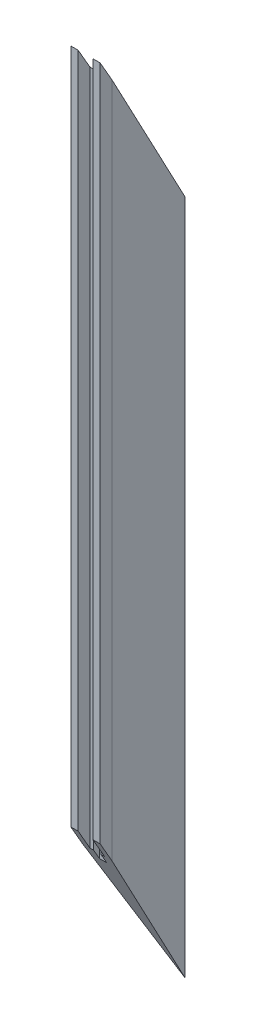
ISO-10303-21;
HEADER;
FILE_DESCRIPTION(('STEP AP214'),'2;1');
FILE_NAME('part.step','',(''),(''),'','','');
FILE_SCHEMA(('AUTOMOTIVE_DESIGN { 1 0 10303 214 1 1 1 1 }'));
ENDSEC;
DATA;
#1=APPLICATION_CONTEXT('core data for automotive mechanical design processes');
#2=APPLICATION_PROTOCOL_DEFINITION('international standard','automotive_design',2000,#1);
#3=PRODUCT_CONTEXT('',#1,'mechanical');
#4=PRODUCT('Part','Part','',(#3));
#5=PRODUCT_RELATED_PRODUCT_CATEGORY('part','',(#4));
#6=PRODUCT_DEFINITION_FORMATION('','',#4);
#7=PRODUCT_DEFINITION_CONTEXT('part definition',#1,'design');
#8=PRODUCT_DEFINITION('design','',#6,#7);
#9=PRODUCT_DEFINITION_SHAPE('','',#8);
#10=(LENGTH_UNIT() NAMED_UNIT(*) SI_UNIT(.MILLI.,.METRE.));
#11=(NAMED_UNIT(*) PLANE_ANGLE_UNIT() SI_UNIT($,.RADIAN.));
#12=(NAMED_UNIT(*) SI_UNIT($,.STERADIAN.) SOLID_ANGLE_UNIT());
#13=UNCERTAINTY_MEASURE_WITH_UNIT(LENGTH_MEASURE(1.E-05),#10,'distance_accuracy_value','');
#14=(GEOMETRIC_REPRESENTATION_CONTEXT(3) GLOBAL_UNCERTAINTY_ASSIGNED_CONTEXT((#13)) GLOBAL_UNIT_ASSIGNED_CONTEXT((#10,
#11,#12)) REPRESENTATION_CONTEXT('',''));
#15=CARTESIAN_POINT('',(0.,0.,0.));
#16=DIRECTION('',(0.,0.,1.));
#17=DIRECTION('',(1.,0.,0.));
#18=AXIS2_PLACEMENT_3D('',#15,#16,#17);
#19=CARTESIAN_POINT('',(0.,369.316,-38.1));
#20=DIRECTION('',(-0.986393923832144,0.,0.164398987305357));
#21=DIRECTION('',(0.164398987305357,0.,0.986393923832144));
#22=AXIS2_PLACEMENT_3D('',#19,#20,#21);
#23=PLANE('',#22);
#24=DIRECTION('',(0.,-1.,0.));
#25=VECTOR('',#24,1.);
#26=CARTESIAN_POINT('',(6.35,369.316,0.));
#27=LINE('',#26,#25);
#28=CARTESIAN_POINT('',(6.35,360.481609234908,0.));
#29=VERTEX_POINT('',#28);
#30=CARTESIAN_POINT('',(6.35,67.3656092349079,0.));
#31=VERTEX_POINT('',#30);
#32=EDGE_CURVE('E186',#29,#31,#27,.T.);
#33=ORIENTED_EDGE('',*,*,#32,.T.);
#34=DIRECTION('',(-0.0827960315270938,-0.863920271231371,-0.496776189162563));
#35=VECTOR('',#34,1.);
#36=CARTESIAN_POINT('',(26.3376356292924,275.9229914626,119.925813775755));
#37=LINE('',#36,#35);
#38=CARTESIAN_POINT('',(0.,1.10767849671754,-38.1));
#39=VERTEX_POINT('',#38);
#40=EDGE_CURVE('E60',#31,#39,#37,.T.);
#41=ORIENTED_EDGE('',*,*,#40,.T.);
#42=DIRECTION('',(0.,-1.,0.));
#43=VECTOR('',#42,1.);
#44=CARTESIAN_POINT('',(0.,369.316,-38.1));
#45=LINE('',#44,#43);
#46=CARTESIAN_POINT('',(0.,294.223678496717,-38.1));
#47=VERTEX_POINT('',#46);
#48=EDGE_CURVE('E53',#47,#39,#45,.T.);
#49=ORIENTED_EDGE('',*,*,#48,.F.);
#50=DIRECTION('',(0.0827960315270937,0.863920271231371,0.496776189162562));
#51=VECTOR('',#50,1.);
#52=CARTESIAN_POINT('',(5.37129143153682,350.269451039301,-5.87225141077907));
#53=LINE('',#52,#51);
#54=EDGE_CURVE('E184',#47,#29,#53,.T.);
#55=ORIENTED_EDGE('',*,*,#54,.T.);
#56=EDGE_LOOP('',(#33,#41,#49,#55));
#57=FACE_BOUND('',#56,.T.);
#58=ADVANCED_FACE('F45',(#57),#23,.F.);
#59=CARTESIAN_POINT('',(0.,369.316,-38.1));
#60=DIRECTION('',(0.986393923832144,0.,0.164398987305357));
#61=DIRECTION('',(0.164398987305357,0.,-0.986393923832144));
#62=AXIS2_PLACEMENT_3D('',#59,#60,#61);
#63=PLANE('',#62);
#64=ORIENTED_EDGE('',*,*,#48,.T.);
#65=DIRECTION('',(-0.0827960315270938,0.863920271231371,0.496776189162563));
#66=VECTOR('',#65,1.);
#67=CARTESIAN_POINT('',(-26.3376356292924,275.9229914626,119.925813775755));
#68=LINE('',#67,#66);
#69=CARTESIAN_POINT('',(-6.35,67.3656092349079,0.));
#70=VERTEX_POINT('',#69);
#71=EDGE_CURVE('E179',#39,#70,#68,.T.);
#72=ORIENTED_EDGE('',*,*,#71,.T.);
#73=DIRECTION('',(0.,-1.,0.));
#74=VECTOR('',#73,1.);
#75=CARTESIAN_POINT('',(-6.35,369.316,0.));
#76=LINE('',#75,#74);
#77=CARTESIAN_POINT('',(-6.35,360.481609234908,0.));
#78=VERTEX_POINT('',#77);
#79=EDGE_CURVE('E159',#78,#70,#76,.T.);
#80=ORIENTED_EDGE('',*,*,#79,.F.);
#81=DIRECTION('',(0.0827960315270937,-0.863920271231371,-0.496776189162562));
#82=VECTOR('',#81,1.);
#83=CARTESIAN_POINT('',(-5.37129143153682,350.269451039301,-5.87225141077907));
#84=LINE('',#83,#82);
#85=EDGE_CURVE('E180',#78,#47,#84,.T.);
#86=ORIENTED_EDGE('',*,*,#85,.T.);
#87=EDGE_LOOP('',(#64,#72,#80,#86));
#88=FACE_BOUND('',#87,.T.);
#89=ADVANCED_FACE('F178',(#88),#63,.F.);
#90=CARTESIAN_POINT('',(-6.35,369.316,5.08));
#91=DIRECTION('',(1.,0.,0.));
#92=DIRECTION('',(0.,0.,-1.));
#93=AXIS2_PLACEMENT_3D('',#90,#91,#92);
#94=PLANE('',#93);
#95=ORIENTED_EDGE('',*,*,#79,.T.);
#96=DIRECTION('',(0.,-0.866896748935602,-0.498487739753831));
#97=VECTOR('',#96,1.);
#98=CARTESIAN_POINT('',(-6.35,76.2,5.08));
#99=LINE('',#98,#97);
#100=CARTESIAN_POINT('',(-6.35,76.2,5.08));
#101=VERTEX_POINT('',#100);
#102=EDGE_CURVE('E140',#101,#70,#99,.T.);
#103=ORIENTED_EDGE('',*,*,#102,.F.);
#104=DIRECTION('',(0.,-1.,0.));
#105=VECTOR('',#104,1.);
#106=CARTESIAN_POINT('',(-6.35,369.316,5.08));
#107=LINE('',#106,#105);
#108=CARTESIAN_POINT('',(-6.35,369.316,5.08));
#109=VERTEX_POINT('',#108);
#110=EDGE_CURVE('E156',#109,#101,#107,.T.);
#111=ORIENTED_EDGE('',*,*,#110,.F.);
#112=DIRECTION('',(0.,0.866896748935602,0.498487739753831));
#113=VECTOR('',#112,1.);
#114=CARTESIAN_POINT('',(-6.35,369.316,5.08));
#115=LINE('',#114,#113);
#116=EDGE_CURVE('E219',#78,#109,#115,.T.);
#117=ORIENTED_EDGE('',*,*,#116,.F.);
#118=EDGE_LOOP('',(#95,#103,#111,#117));
#119=FACE_BOUND('',#118,.T.);
#120=ADVANCED_FACE('F154',(#119),#94,.F.);
#121=CARTESIAN_POINT('',(-3.175,369.316,5.08));
#122=DIRECTION('',(0.,0.,-1.));
#123=DIRECTION('',(-1.,0.,0.));
#124=AXIS2_PLACEMENT_3D('',#121,#122,#123);
#125=PLANE('',#124);
#126=ORIENTED_EDGE('',*,*,#110,.T.);
#127=DIRECTION('',(-1.,0.,0.));
#128=VECTOR('',#127,1.);
#129=CARTESIAN_POINT('',(11.176,76.2,5.08));
#130=LINE('',#129,#128);
#131=CARTESIAN_POINT('',(-3.175,76.2,5.08));
#132=VERTEX_POINT('',#131);
#133=EDGE_CURVE('E137',#132,#101,#130,.T.);
#134=ORIENTED_EDGE('',*,*,#133,.F.);
#135=DIRECTION('',(0.,-1.,0.));
#136=VECTOR('',#135,1.);
#137=CARTESIAN_POINT('',(-3.175,369.316,5.08));
#138=LINE('',#137,#136);
#139=CARTESIAN_POINT('',(-3.175,369.316,5.08));
#140=VERTEX_POINT('',#139);
#141=EDGE_CURVE('E165',#140,#132,#138,.T.);
#142=ORIENTED_EDGE('',*,*,#141,.F.);
#143=DIRECTION('',(1.,0.,0.));
#144=VECTOR('',#143,1.);
#145=CARTESIAN_POINT('',(-3.175,369.316,5.08));
#146=LINE('',#145,#144);
#147=EDGE_CURVE('E163',#109,#140,#146,.T.);
#148=ORIENTED_EDGE('',*,*,#147,.F.);
#149=EDGE_LOOP('',(#126,#134,#142,#148));
#150=FACE_BOUND('',#149,.T.);
#151=ADVANCED_FACE('F162',(#150),#125,.F.);
#152=CARTESIAN_POINT('',(-3.175,369.316,0.));
#153=DIRECTION('',(-1.,0.,0.));
#154=DIRECTION('',(0.,0.,1.));
#155=AXIS2_PLACEMENT_3D('',#152,#153,#154);
#156=PLANE('',#155);
#157=ORIENTED_EDGE('',*,*,#141,.T.);
#158=DIRECTION('',(0.,-0.866896748935602,-0.498487739753831));
#159=VECTOR('',#158,1.);
#160=CARTESIAN_POINT('',(-3.17499999999998,294.284339341271,130.484057089172));
#161=LINE('',#160,#159);
#162=CARTESIAN_POINT('',(-3.175,67.365609234908,0.));
#163=VERTEX_POINT('',#162);
#164=EDGE_CURVE('E143',#132,#163,#161,.T.);
#165=ORIENTED_EDGE('',*,*,#164,.T.);
#166=DIRECTION('',(0.,-1.,0.));
#167=VECTOR('',#166,1.);
#168=CARTESIAN_POINT('',(-3.175,369.316,0.));
#169=LINE('',#168,#167);
#170=CARTESIAN_POINT('',(-3.175,360.481609234908,0.));
#171=VERTEX_POINT('',#170);
#172=EDGE_CURVE('E170',#171,#163,#169,.T.);
#173=ORIENTED_EDGE('',*,*,#172,.F.);
#174=DIRECTION('',(0.,0.866896748935602,0.498487739753831));
#175=VECTOR('',#174,1.);
#176=CARTESIAN_POINT('',(-3.175,367.120742003038,3.81767066444079));
#177=LINE('',#176,#175);
#178=EDGE_CURVE('E252',#171,#140,#177,.T.);
#179=ORIENTED_EDGE('',*,*,#178,.T.);
#180=EDGE_LOOP('',(#157,#165,#173,#179));
#181=FACE_BOUND('',#180,.T.);
#182=ADVANCED_FACE('F297',(#181),#156,.F.);
#183=CARTESIAN_POINT('',(-3.175,369.316,0.));
#184=DIRECTION('',(0.,0.,-1.));
#185=DIRECTION('',(-1.,0.,0.));
#186=AXIS2_PLACEMENT_3D('',#183,#184,#185);
#187=PLANE('',#186);
#188=ORIENTED_EDGE('',*,*,#172,.T.);
#189=DIRECTION('',(1.,0.,0.));
#190=VECTOR('',#189,1.);
#191=CARTESIAN_POINT('',(-3.17500000000013,67.365609234908,0.));
#192=LINE('',#191,#190);
#193=CARTESIAN_POINT('',(-1.5875,67.3656092349079,0.));
#194=VERTEX_POINT('',#193);
#195=EDGE_CURVE('E213',#163,#194,#192,.T.);
#196=ORIENTED_EDGE('',*,*,#195,.T.);
#197=DIRECTION('',(0.,-1.,0.));
#198=VECTOR('',#197,1.);
#199=CARTESIAN_POINT('',(-1.5875,369.316,0.));
#200=LINE('',#199,#198);
#201=CARTESIAN_POINT('',(-1.5875,360.481609234908,0.));
#202=VERTEX_POINT('',#201);
#203=EDGE_CURVE('E287',#202,#194,#200,.T.);
#204=ORIENTED_EDGE('',*,*,#203,.F.);
#205=DIRECTION('',(-1.,0.,0.));
#206=VECTOR('',#205,1.);
#207=CARTESIAN_POINT('',(-3.175,360.481609234908,0.));
#208=LINE('',#207,#206);
#209=EDGE_CURVE('E248',#202,#171,#208,.T.);
#210=ORIENTED_EDGE('',*,*,#209,.T.);
#211=EDGE_LOOP('',(#188,#196,#204,#210));
#212=FACE_BOUND('',#211,.T.);
#213=ADVANCED_FACE('F294',(#212),#187,.F.);
#214=CARTESIAN_POINT('',(-1.5875,369.316,0.));
#215=DIRECTION('',(-1.,0.,0.));
#216=DIRECTION('',(0.,0.,1.));
#217=AXIS2_PLACEMENT_3D('',#214,#215,#216);
#218=PLANE('',#217);
#219=ORIENTED_EDGE('',*,*,#203,.T.);
#220=DIRECTION('',(0.,-0.866896748935602,-0.498487739753831));
#221=VECTOR('',#220,1.);
#222=CARTESIAN_POINT('',(-1.5875,294.284339341271,130.484057089172));
#223=LINE('',#222,#221);
#224=CARTESIAN_POINT('',(-1.5875,62.9484138523619,-2.54));
#225=VERTEX_POINT('',#224);
#226=EDGE_CURVE('E209',#194,#225,#223,.T.);
#227=ORIENTED_EDGE('',*,*,#226,.T.);
#228=DIRECTION('',(0.,-1.,0.));
#229=VECTOR('',#228,1.);
#230=CARTESIAN_POINT('',(-1.5875,369.316,-2.54));
#231=LINE('',#230,#229);
#232=CARTESIAN_POINT('',(-1.5875,356.064413852362,-2.54));
#233=VERTEX_POINT('',#232);
#234=EDGE_CURVE('E283',#233,#225,#231,.T.);
#235=ORIENTED_EDGE('',*,*,#234,.F.);
#236=DIRECTION('',(0.,0.866896748935602,0.498487739753831));
#237=VECTOR('',#236,1.);
#238=CARTESIAN_POINT('',(-1.5875,367.120742003038,3.81767066444079));
#239=LINE('',#238,#237);
#240=EDGE_CURVE('E244',#233,#202,#239,.T.);
#241=ORIENTED_EDGE('',*,*,#240,.T.);
#242=EDGE_LOOP('',(#219,#227,#235,#241));
#243=FACE_BOUND('',#242,.T.);
#244=ADVANCED_FACE('F319',(#243),#218,.F.);
#245=CARTESIAN_POINT('',(-1.5875,369.316,-2.54));
#246=DIRECTION('',(0.,0.,-1.));
#247=DIRECTION('',(-1.,0.,0.));
#248=AXIS2_PLACEMENT_3D('',#245,#246,#247);
#249=PLANE('',#248);
#250=ORIENTED_EDGE('',*,*,#234,.T.);
#251=DIRECTION('',(1.,0.,0.));
#252=VECTOR('',#251,1.);
#253=CARTESIAN_POINT('',(-1.5875,62.9484138523619,-2.54));
#254=LINE('',#253,#252);
#255=CARTESIAN_POINT('',(1.5875,62.9484138523619,-2.53999999999999));
#256=VERTEX_POINT('',#255);
#257=EDGE_CURVE('E205',#225,#256,#254,.T.);
#258=ORIENTED_EDGE('',*,*,#257,.T.);
#259=DIRECTION('',(0.,-1.,0.));
#260=VECTOR('',#259,1.);
#261=CARTESIAN_POINT('',(1.5875,369.316,-2.54));
#262=LINE('',#261,#260);
#263=CARTESIAN_POINT('',(1.5875,356.064413852362,-2.54));
#264=VERTEX_POINT('',#263);
#265=EDGE_CURVE('E279',#264,#256,#262,.T.);
#266=ORIENTED_EDGE('',*,*,#265,.F.);
#267=DIRECTION('',(-1.,0.,0.));
#268=VECTOR('',#267,1.);
#269=CARTESIAN_POINT('',(-1.5875,356.064413852362,-2.54));
#270=LINE('',#269,#268);
#271=EDGE_CURVE('E240',#264,#233,#270,.T.);
#272=ORIENTED_EDGE('',*,*,#271,.T.);
#273=EDGE_LOOP('',(#250,#258,#266,#272));
#274=FACE_BOUND('',#273,.T.);
#275=ADVANCED_FACE('F316',(#274),#249,.F.);
#276=CARTESIAN_POINT('',(1.5875,369.316,-2.54));
#277=DIRECTION('',(1.,0.,0.));
#278=DIRECTION('',(0.,0.,-1.));
#279=AXIS2_PLACEMENT_3D('',#276,#277,#278);
#280=PLANE('',#279);
#281=ORIENTED_EDGE('',*,*,#265,.T.);
#282=DIRECTION('',(0.,0.866896748935602,0.498487739753831));
#283=VECTOR('',#282,1.);
#284=CARTESIAN_POINT('',(1.5875,293.18671034279,129.852892421392));
#285=LINE('',#284,#283);
#286=CARTESIAN_POINT('',(1.5875,67.365609234908,0.));
#287=VERTEX_POINT('',#286);
#288=EDGE_CURVE('E201',#256,#287,#285,.T.);
#289=ORIENTED_EDGE('',*,*,#288,.T.);
#290=DIRECTION('',(0.,-1.,0.));
#291=VECTOR('',#290,1.);
#292=CARTESIAN_POINT('',(1.5875,369.316,0.));
#293=LINE('',#292,#291);
#294=CARTESIAN_POINT('',(1.5875,360.481609234908,0.));
#295=VERTEX_POINT('',#294);
#296=EDGE_CURVE('E275',#295,#287,#293,.T.);
#297=ORIENTED_EDGE('',*,*,#296,.F.);
#298=DIRECTION('',(0.,-0.866896748935602,-0.498487739753831));
#299=VECTOR('',#298,1.);
#300=CARTESIAN_POINT('',(1.5875,366.023113004556,3.18650599666119));
#301=LINE('',#300,#299);
#302=EDGE_CURVE('E236',#295,#264,#301,.T.);
#303=ORIENTED_EDGE('',*,*,#302,.T.);
#304=EDGE_LOOP('',(#281,#289,#297,#303));
#305=FACE_BOUND('',#304,.T.);
#306=ADVANCED_FACE('F313',(#305),#280,.F.);
#307=CARTESIAN_POINT('',(1.5875,369.316,0.));
#308=DIRECTION('',(0.,0.,-1.));
#309=DIRECTION('',(-1.,0.,0.));
#310=AXIS2_PLACEMENT_3D('',#307,#308,#309);
#311=PLANE('',#310);
#312=ORIENTED_EDGE('',*,*,#296,.T.);
#313=DIRECTION('',(1.,0.,0.));
#314=VECTOR('',#313,1.);
#315=CARTESIAN_POINT('',(1.5875,67.365609234908,0.));
#316=LINE('',#315,#314);
#317=CARTESIAN_POINT('',(3.175,67.365609234908,0.));
#318=VERTEX_POINT('',#317);
#319=EDGE_CURVE('E197',#287,#318,#316,.T.);
#320=ORIENTED_EDGE('',*,*,#319,.T.);
#321=DIRECTION('',(0.,-1.,0.));
#322=VECTOR('',#321,1.);
#323=CARTESIAN_POINT('',(3.175,369.316,0.));
#324=LINE('',#323,#322);
#325=CARTESIAN_POINT('',(3.175,360.481609234908,0.));
#326=VERTEX_POINT('',#325);
#327=EDGE_CURVE('E271',#326,#318,#324,.T.);
#328=ORIENTED_EDGE('',*,*,#327,.F.);
#329=DIRECTION('',(-1.,0.,0.));
#330=VECTOR('',#329,1.);
#331=CARTESIAN_POINT('',(1.5875,360.481609234908,0.));
#332=LINE('',#331,#330);
#333=EDGE_CURVE('E232',#326,#295,#332,.T.);
#334=ORIENTED_EDGE('',*,*,#333,.T.);
#335=EDGE_LOOP('',(#312,#320,#328,#334));
#336=FACE_BOUND('',#335,.T.);
#337=ADVANCED_FACE('F310',(#336),#311,.F.);
#338=CARTESIAN_POINT('',(3.175,369.316,0.));
#339=DIRECTION('',(1.,0.,0.));
#340=DIRECTION('',(0.,0.,-1.));
#341=AXIS2_PLACEMENT_3D('',#338,#339,#340);
#342=PLANE('',#341);
#343=ORIENTED_EDGE('',*,*,#327,.T.);
#344=DIRECTION('',(0.,0.866896748935602,0.498487739753831));
#345=VECTOR('',#344,1.);
#346=CARTESIAN_POINT('',(3.175,294.284339341271,130.484057089172));
#347=LINE('',#346,#345);
#348=CARTESIAN_POINT('',(3.175,76.2,5.08));
#349=VERTEX_POINT('',#348);
#350=EDGE_CURVE('E191',#318,#349,#347,.T.);
#351=ORIENTED_EDGE('',*,*,#350,.T.);
#352=DIRECTION('',(0.,-1.,0.));
#353=VECTOR('',#352,1.);
#354=CARTESIAN_POINT('',(3.175,369.316,5.08));
#355=LINE('',#354,#353);
#356=CARTESIAN_POINT('',(3.175,369.316,5.08));
#357=VERTEX_POINT('',#356);
#358=EDGE_CURVE('E267',#357,#349,#355,.T.);
#359=ORIENTED_EDGE('',*,*,#358,.F.);
#360=DIRECTION('',(0.,-0.866896748935602,-0.498487739753831));
#361=VECTOR('',#360,1.);
#362=CARTESIAN_POINT('',(3.175,367.120742003038,3.81767066444079));
#363=LINE('',#362,#361);
#364=EDGE_CURVE('E67',#357,#326,#363,.T.);
#365=ORIENTED_EDGE('',*,*,#364,.T.);
#366=EDGE_LOOP('',(#343,#351,#359,#365));
#367=FACE_BOUND('',#366,.T.);
#368=ADVANCED_FACE('F307',(#367),#342,.F.);
#369=CARTESIAN_POINT('',(3.175,369.316,5.08));
#370=DIRECTION('',(0.,0.,-1.));
#371=DIRECTION('',(-1.,0.,0.));
#372=AXIS2_PLACEMENT_3D('',#369,#370,#371);
#373=PLANE('',#372);
#374=ORIENTED_EDGE('',*,*,#358,.T.);
#375=CARTESIAN_POINT('',(6.35,76.2,5.08));
#376=VERTEX_POINT('',#375);
#377=EDGE_CURVE('E149',#376,#349,#130,.T.);
#378=ORIENTED_EDGE('',*,*,#377,.F.);
#379=DIRECTION('',(0.,-1.,0.));
#380=VECTOR('',#379,1.);
#381=CARTESIAN_POINT('',(6.35,369.316,5.08));
#382=LINE('',#381,#380);
#383=CARTESIAN_POINT('',(6.35,369.316,5.08));
#384=VERTEX_POINT('',#383);
#385=EDGE_CURVE('E263',#384,#376,#382,.T.);
#386=ORIENTED_EDGE('',*,*,#385,.F.);
#387=DIRECTION('',(1.,0.,0.));
#388=VECTOR('',#387,1.);
#389=CARTESIAN_POINT('',(3.175,369.316,5.08));
#390=LINE('',#389,#388);
#391=EDGE_CURVE('E258',#357,#384,#390,.T.);
#392=ORIENTED_EDGE('',*,*,#391,.F.);
#393=EDGE_LOOP('',(#374,#378,#386,#392));
#394=FACE_BOUND('',#393,.T.);
#395=ADVANCED_FACE('F305',(#394),#373,.F.);
#396=CARTESIAN_POINT('',(6.35,369.316,5.08));
#397=DIRECTION('',(-1.,0.,0.));
#398=DIRECTION('',(0.,0.,1.));
#399=AXIS2_PLACEMENT_3D('',#396,#397,#398);
#400=PLANE('',#399);
#401=ORIENTED_EDGE('',*,*,#385,.T.);
#402=DIRECTION('',(0.,-0.866896748935602,-0.498487739753831));
#403=VECTOR('',#402,1.);
#404=CARTESIAN_POINT('',(6.35,296.479597338234,131.746386424731));
#405=LINE('',#404,#403);
#406=EDGE_CURVE('E11',#376,#31,#405,.T.);
#407=ORIENTED_EDGE('',*,*,#406,.T.);
#408=ORIENTED_EDGE('',*,*,#32,.F.);
#409=DIRECTION('',(0.,0.866896748935602,0.498487739753831));
#410=VECTOR('',#409,1.);
#411=CARTESIAN_POINT('',(6.35,369.316,5.08));
#412=LINE('',#411,#410);
#413=EDGE_CURVE('E222',#29,#384,#412,.T.);
#414=ORIENTED_EDGE('',*,*,#413,.T.);
#415=EDGE_LOOP('',(#401,#407,#408,#414));
#416=FACE_BOUND('',#415,.T.);
#417=ADVANCED_FACE('F302',(#416),#400,.F.);
#418=CARTESIAN_POINT('',(11.176,369.316,5.08));
#419=DIRECTION('',(0.,-0.498487739753831,0.866896748935602));
#420=DIRECTION('',(0.,-0.866896748935602,-0.498487739753831));
#421=AXIS2_PLACEMENT_3D('',#418,#419,#420);
#422=PLANE('',#421);
#423=ORIENTED_EDGE('',*,*,#209,.F.);
#424=ORIENTED_EDGE('',*,*,#240,.F.);
#425=ORIENTED_EDGE('',*,*,#271,.F.);
#426=ORIENTED_EDGE('',*,*,#302,.F.);
#427=ORIENTED_EDGE('',*,*,#333,.F.);
#428=ORIENTED_EDGE('',*,*,#364,.F.);
#429=ORIENTED_EDGE('',*,*,#391,.T.);
#430=ORIENTED_EDGE('',*,*,#413,.F.);
#431=ORIENTED_EDGE('',*,*,#54,.F.);
#432=ORIENTED_EDGE('',*,*,#85,.F.);
#433=ORIENTED_EDGE('',*,*,#116,.T.);
#434=ORIENTED_EDGE('',*,*,#147,.T.);
#435=ORIENTED_EDGE('',*,*,#178,.F.);
#436=EDGE_LOOP('',(#423,#424,#425,#426,#427,#428,#429,#430,#431,#432,#433,#434,#435));
#437=FACE_BOUND('',#436,.T.);
#438=ADVANCED_FACE('F298',(#437),#422,.F.);
#439=CARTESIAN_POINT('',(11.176,76.2,5.08));
#440=DIRECTION('',(0.,0.498487739753831,-0.866896748935602));
#441=DIRECTION('',(0.,0.866896748935602,0.498487739753831));
#442=AXIS2_PLACEMENT_3D('',#439,#440,#441);
#443=PLANE('',#442);
#444=ORIENTED_EDGE('',*,*,#133,.T.);
#445=ORIENTED_EDGE('',*,*,#102,.T.);
#446=ORIENTED_EDGE('',*,*,#71,.F.);
#447=ORIENTED_EDGE('',*,*,#40,.F.);
#448=ORIENTED_EDGE('',*,*,#406,.F.);
#449=ORIENTED_EDGE('',*,*,#377,.T.);
#450=ORIENTED_EDGE('',*,*,#350,.F.);
#451=ORIENTED_EDGE('',*,*,#319,.F.);
#452=ORIENTED_EDGE('',*,*,#288,.F.);
#453=ORIENTED_EDGE('',*,*,#257,.F.);
#454=ORIENTED_EDGE('',*,*,#226,.F.);
#455=ORIENTED_EDGE('',*,*,#195,.F.);
#456=ORIENTED_EDGE('',*,*,#164,.F.);
#457=EDGE_LOOP('',(#444,#445,#446,#447,#448,#449,#450,#451,#452,#453,#454,#455,#456));
#458=FACE_BOUND('',#457,.T.);
#459=ADVANCED_FACE('F139',(#458),#443,.F.);
#460=CLOSED_SHELL('',(#58,#89,#120,#151,#182,#213,#244,#275,#306,#337,#368,#395,#417,#438,#459));
#461=MANIFOLD_SOLID_BREP('B2',#460);
#462=ADVANCED_BREP_SHAPE_REPRESENTATION('',(#18,#461),#14);
#463=SHAPE_DEFINITION_REPRESENTATION(#9,#462);
ENDSEC;
END-ISO-10303-21;
